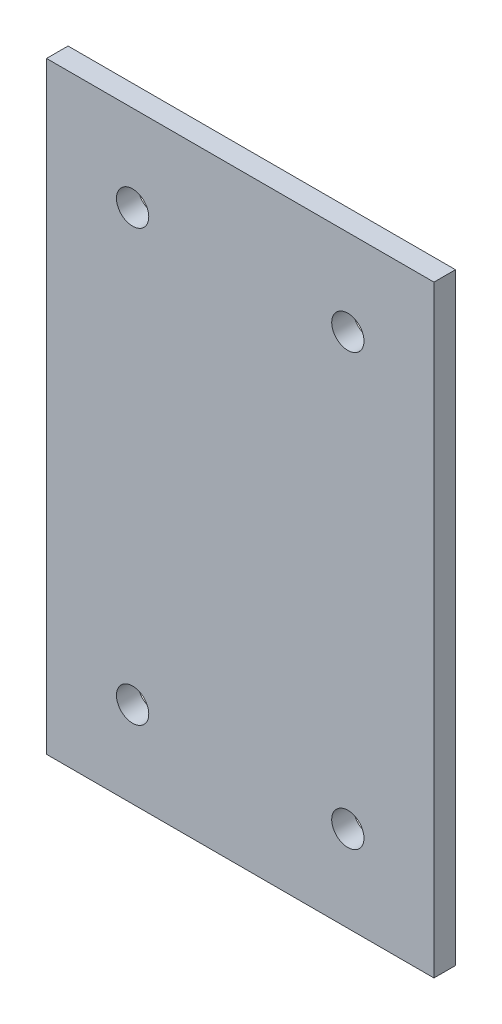
ISO-10303-21;
HEADER;
FILE_DESCRIPTION(('STEP AP214'),'2;1');
FILE_NAME('part.step','',(''),(''),'','','');
FILE_SCHEMA(('AUTOMOTIVE_DESIGN { 1 0 10303 214 1 1 1 1 }'));
ENDSEC;
DATA;
#1=APPLICATION_CONTEXT('core data for automotive mechanical design processes');
#2=APPLICATION_PROTOCOL_DEFINITION('international standard','automotive_design',2000,#1);
#3=PRODUCT_CONTEXT('',#1,'mechanical');
#4=PRODUCT('Part','Part','',(#3));
#5=PRODUCT_RELATED_PRODUCT_CATEGORY('part','',(#4));
#6=PRODUCT_DEFINITION_FORMATION('','',#4);
#7=PRODUCT_DEFINITION_CONTEXT('part definition',#1,'design');
#8=PRODUCT_DEFINITION('design','',#6,#7);
#9=PRODUCT_DEFINITION_SHAPE('','',#8);
#10=(LENGTH_UNIT() NAMED_UNIT(*) SI_UNIT(.MILLI.,.METRE.));
#11=(NAMED_UNIT(*) PLANE_ANGLE_UNIT() SI_UNIT($,.RADIAN.));
#12=(NAMED_UNIT(*) SI_UNIT($,.STERADIAN.) SOLID_ANGLE_UNIT());
#13=UNCERTAINTY_MEASURE_WITH_UNIT(LENGTH_MEASURE(1.E-05),#10,'distance_accuracy_value','');
#14=(GEOMETRIC_REPRESENTATION_CONTEXT(3) GLOBAL_UNCERTAINTY_ASSIGNED_CONTEXT((#13)) GLOBAL_UNIT_ASSIGNED_CONTEXT((#10,
#11,#12)) REPRESENTATION_CONTEXT('',''));
#15=CARTESIAN_POINT('',(0.,0.,0.));
#16=DIRECTION('',(0.,0.,1.));
#17=DIRECTION('',(1.,0.,0.));
#18=AXIS2_PLACEMENT_3D('',#15,#16,#17);
#19=CARTESIAN_POINT('',(0.,0.,2.));
#20=DIRECTION('',(0.,0.,-1.));
#21=DIRECTION('',(-1.,0.,0.));
#22=AXIS2_PLACEMENT_3D('',#19,#20,#21);
#23=PLANE('',#22);
#24=DIRECTION('',(0.,-1.,0.));
#25=VECTOR('',#24,1.);
#26=CARTESIAN_POINT('',(0.,0.,2.));
#27=LINE('',#26,#25);
#28=CARTESIAN_POINT('',(0.,56.,2.));
#29=VERTEX_POINT('',#28);
#30=CARTESIAN_POINT('',(0.,0.,2.));
#31=VERTEX_POINT('',#30);
#32=EDGE_CURVE('E92',#29,#31,#27,.T.);
#33=ORIENTED_EDGE('',*,*,#32,.T.);
#34=DIRECTION('',(1.,0.,0.));
#35=VECTOR('',#34,1.);
#36=CARTESIAN_POINT('',(0.,0.,2.));
#37=LINE('',#36,#35);
#38=CARTESIAN_POINT('',(36.,0.,2.));
#39=VERTEX_POINT('',#38);
#40=EDGE_CURVE('E87',#31,#39,#37,.T.);
#41=ORIENTED_EDGE('',*,*,#40,.T.);
#42=DIRECTION('',(0.,1.,0.));
#43=VECTOR('',#42,1.);
#44=CARTESIAN_POINT('',(36.,0.,2.));
#45=LINE('',#44,#43);
#46=CARTESIAN_POINT('',(36.,56.,2.));
#47=VERTEX_POINT('',#46);
#48=EDGE_CURVE('E90',#39,#47,#45,.T.);
#49=ORIENTED_EDGE('',*,*,#48,.T.);
#50=DIRECTION('',(-1.,0.,0.));
#51=VECTOR('',#50,1.);
#52=CARTESIAN_POINT('',(0.,56.,2.));
#53=LINE('',#52,#51);
#54=EDGE_CURVE('E57',#47,#29,#53,.T.);
#55=ORIENTED_EDGE('',*,*,#54,.T.);
#56=EDGE_LOOP('',(#33,#41,#49,#55));
#57=FACE_BOUND('',#56,.T.);
#58=CARTESIAN_POINT('',(8.,8.,2.));
#59=DIRECTION('',(0.,0.,1.));
#60=DIRECTION('',(1.,0.,0.));
#61=AXIS2_PLACEMENT_3D('',#58,#59,#60);
#62=CIRCLE('',#61,1.5);
#63=CARTESIAN_POINT('',(9.5,8.,2.));
#64=VERTEX_POINT('',#63);
#65=EDGE_CURVE('E112',#64,#64,#62,.T.);
#66=ORIENTED_EDGE('',*,*,#65,.F.);
#67=EDGE_LOOP('',(#66));
#68=FACE_BOUND('',#67,.T.);
#69=CARTESIAN_POINT('',(28.,8.,2.));
#70=DIRECTION('',(0.,0.,1.));
#71=DIRECTION('',(1.,0.,0.));
#72=AXIS2_PLACEMENT_3D('',#69,#70,#71);
#73=CIRCLE('',#72,1.5);
#74=CARTESIAN_POINT('',(29.5,8.,2.));
#75=VERTEX_POINT('',#74);
#76=EDGE_CURVE('E134',#75,#75,#73,.T.);
#77=ORIENTED_EDGE('',*,*,#76,.F.);
#78=EDGE_LOOP('',(#77));
#79=FACE_BOUND('',#78,.T.);
#80=CARTESIAN_POINT('',(28.,48.,2.));
#81=DIRECTION('',(0.,0.,1.));
#82=DIRECTION('',(1.,0.,0.));
#83=AXIS2_PLACEMENT_3D('',#80,#81,#82);
#84=CIRCLE('',#83,1.5);
#85=CARTESIAN_POINT('',(29.5,48.,2.));
#86=VERTEX_POINT('',#85);
#87=EDGE_CURVE('E142',#86,#86,#84,.T.);
#88=ORIENTED_EDGE('',*,*,#87,.F.);
#89=EDGE_LOOP('',(#88));
#90=FACE_BOUND('',#89,.T.);
#91=CARTESIAN_POINT('',(8.,48.,2.));
#92=DIRECTION('',(0.,0.,1.));
#93=DIRECTION('',(1.,0.,0.));
#94=AXIS2_PLACEMENT_3D('',#91,#92,#93);
#95=CIRCLE('',#94,1.5);
#96=CARTESIAN_POINT('',(9.5,48.,2.));
#97=VERTEX_POINT('',#96);
#98=EDGE_CURVE('E150',#97,#97,#95,.T.);
#99=ORIENTED_EDGE('',*,*,#98,.F.);
#100=EDGE_LOOP('',(#99));
#101=FACE_BOUND('',#100,.T.);
#102=ADVANCED_FACE('F39',(#57,#68,#79,#90,#101),#23,.F.);
#103=CARTESIAN_POINT('',(0.,0.,0.));
#104=DIRECTION('',(0.,0.,-1.));
#105=DIRECTION('',(-1.,0.,0.));
#106=AXIS2_PLACEMENT_3D('',#103,#104,#105);
#107=PLANE('',#106);
#108=CARTESIAN_POINT('',(28.,48.,0.));
#109=DIRECTION('',(0.,0.,1.));
#110=DIRECTION('',(1.,0.,0.));
#111=AXIS2_PLACEMENT_3D('',#108,#109,#110);
#112=CIRCLE('',#111,1.5);
#113=CARTESIAN_POINT('',(29.5,48.,0.));
#114=VERTEX_POINT('',#113);
#115=EDGE_CURVE('E146',#114,#114,#112,.T.);
#116=ORIENTED_EDGE('',*,*,#115,.T.);
#117=EDGE_LOOP('',(#116));
#118=FACE_BOUND('',#117,.T.);
#119=CARTESIAN_POINT('',(8.,8.,0.));
#120=DIRECTION('',(0.,0.,1.));
#121=DIRECTION('',(1.,0.,0.));
#122=AXIS2_PLACEMENT_3D('',#119,#120,#121);
#123=CIRCLE('',#122,1.5);
#124=CARTESIAN_POINT('',(9.5,8.,0.));
#125=VERTEX_POINT('',#124);
#126=EDGE_CURVE('E130',#125,#125,#123,.T.);
#127=ORIENTED_EDGE('',*,*,#126,.T.);
#128=EDGE_LOOP('',(#127));
#129=FACE_BOUND('',#128,.T.);
#130=DIRECTION('',(0.,-1.,0.));
#131=VECTOR('',#130,1.);
#132=CARTESIAN_POINT('',(0.,0.,0.));
#133=LINE('',#132,#131);
#134=CARTESIAN_POINT('',(0.,56.,0.));
#135=VERTEX_POINT('',#134);
#136=CARTESIAN_POINT('',(0.,0.,0.));
#137=VERTEX_POINT('',#136);
#138=EDGE_CURVE('E108',#135,#137,#133,.T.);
#139=ORIENTED_EDGE('',*,*,#138,.F.);
#140=DIRECTION('',(-1.,0.,0.));
#141=VECTOR('',#140,1.);
#142=CARTESIAN_POINT('',(0.,56.,0.));
#143=LINE('',#142,#141);
#144=CARTESIAN_POINT('',(36.,56.,0.));
#145=VERTEX_POINT('',#144);
#146=EDGE_CURVE('E80',#145,#135,#143,.T.);
#147=ORIENTED_EDGE('',*,*,#146,.F.);
#148=DIRECTION('',(0.,1.,0.));
#149=VECTOR('',#148,1.);
#150=CARTESIAN_POINT('',(36.,0.,0.));
#151=LINE('',#150,#149);
#152=CARTESIAN_POINT('',(36.,0.,0.));
#153=VERTEX_POINT('',#152);
#154=EDGE_CURVE('E74',#153,#145,#151,.T.);
#155=ORIENTED_EDGE('',*,*,#154,.F.);
#156=DIRECTION('',(1.,0.,0.));
#157=VECTOR('',#156,1.);
#158=CARTESIAN_POINT('',(0.,0.,0.));
#159=LINE('',#158,#157);
#160=EDGE_CURVE('E97',#137,#153,#159,.T.);
#161=ORIENTED_EDGE('',*,*,#160,.F.);
#162=EDGE_LOOP('',(#139,#147,#155,#161));
#163=FACE_BOUND('',#162,.T.);
#164=CARTESIAN_POINT('',(28.,8.,0.));
#165=DIRECTION('',(0.,0.,1.));
#166=DIRECTION('',(1.,0.,0.));
#167=AXIS2_PLACEMENT_3D('',#164,#165,#166);
#168=CIRCLE('',#167,1.5);
#169=CARTESIAN_POINT('',(29.5,8.,0.));
#170=VERTEX_POINT('',#169);
#171=EDGE_CURVE('E138',#170,#170,#168,.T.);
#172=ORIENTED_EDGE('',*,*,#171,.T.);
#173=EDGE_LOOP('',(#172));
#174=FACE_BOUND('',#173,.T.);
#175=CARTESIAN_POINT('',(8.,48.,0.));
#176=DIRECTION('',(0.,0.,1.));
#177=DIRECTION('',(1.,0.,0.));
#178=AXIS2_PLACEMENT_3D('',#175,#176,#177);
#179=CIRCLE('',#178,1.5);
#180=CARTESIAN_POINT('',(9.5,48.,0.));
#181=VERTEX_POINT('',#180);
#182=EDGE_CURVE('E154',#181,#181,#179,.T.);
#183=ORIENTED_EDGE('',*,*,#182,.T.);
#184=EDGE_LOOP('',(#183));
#185=FACE_BOUND('',#184,.T.);
#186=ADVANCED_FACE('F125',(#118,#129,#163,#174,#185),#107,.T.);
#187=CARTESIAN_POINT('',(0.,0.,2.));
#188=DIRECTION('',(1.,0.,0.));
#189=DIRECTION('',(0.,0.,-1.));
#190=AXIS2_PLACEMENT_3D('',#187,#188,#189);
#191=PLANE('',#190);
#192=ORIENTED_EDGE('',*,*,#138,.T.);
#193=DIRECTION('',(0.,0.,-1.));
#194=VECTOR('',#193,1.);
#195=CARTESIAN_POINT('',(0.,0.,2.));
#196=LINE('',#195,#194);
#197=EDGE_CURVE('E11',#31,#137,#196,.T.);
#198=ORIENTED_EDGE('',*,*,#197,.F.);
#199=ORIENTED_EDGE('',*,*,#32,.F.);
#200=DIRECTION('',(0.,0.,-1.));
#201=VECTOR('',#200,1.);
#202=CARTESIAN_POINT('',(0.,56.,2.));
#203=LINE('',#202,#201);
#204=EDGE_CURVE('E104',#29,#135,#203,.T.);
#205=ORIENTED_EDGE('',*,*,#204,.T.);
#206=EDGE_LOOP('',(#192,#198,#199,#205));
#207=FACE_BOUND('',#206,.T.);
#208=ADVANCED_FACE('F41',(#207),#191,.F.);
#209=CARTESIAN_POINT('',(0.,0.,2.));
#210=DIRECTION('',(0.,1.,0.));
#211=DIRECTION('',(0.,0.,1.));
#212=AXIS2_PLACEMENT_3D('',#209,#210,#211);
#213=PLANE('',#212);
#214=ORIENTED_EDGE('',*,*,#160,.T.);
#215=DIRECTION('',(0.,0.,-1.));
#216=VECTOR('',#215,1.);
#217=CARTESIAN_POINT('',(36.,0.,2.));
#218=LINE('',#217,#216);
#219=EDGE_CURVE('E49',#39,#153,#218,.T.);
#220=ORIENTED_EDGE('',*,*,#219,.F.);
#221=ORIENTED_EDGE('',*,*,#40,.F.);
#222=ORIENTED_EDGE('',*,*,#197,.T.);
#223=EDGE_LOOP('',(#214,#220,#221,#222));
#224=FACE_BOUND('',#223,.T.);
#225=ADVANCED_FACE('F96',(#224),#213,.F.);
#226=CARTESIAN_POINT('',(36.,0.,2.));
#227=DIRECTION('',(-1.,0.,0.));
#228=DIRECTION('',(0.,0.,1.));
#229=AXIS2_PLACEMENT_3D('',#226,#227,#228);
#230=PLANE('',#229);
#231=ORIENTED_EDGE('',*,*,#154,.T.);
#232=DIRECTION('',(0.,0.,-1.));
#233=VECTOR('',#232,1.);
#234=CARTESIAN_POINT('',(36.,56.,2.));
#235=LINE('',#234,#233);
#236=EDGE_CURVE('E99',#47,#145,#235,.T.);
#237=ORIENTED_EDGE('',*,*,#236,.F.);
#238=ORIENTED_EDGE('',*,*,#48,.F.);
#239=ORIENTED_EDGE('',*,*,#219,.T.);
#240=EDGE_LOOP('',(#231,#237,#238,#239));
#241=FACE_BOUND('',#240,.T.);
#242=ADVANCED_FACE('F100',(#241),#230,.F.);
#243=CARTESIAN_POINT('',(0.,56.,2.));
#244=DIRECTION('',(0.,-1.,0.));
#245=DIRECTION('',(0.,0.,-1.));
#246=AXIS2_PLACEMENT_3D('',#243,#244,#245);
#247=PLANE('',#246);
#248=ORIENTED_EDGE('',*,*,#146,.T.);
#249=ORIENTED_EDGE('',*,*,#204,.F.);
#250=ORIENTED_EDGE('',*,*,#54,.F.);
#251=ORIENTED_EDGE('',*,*,#236,.T.);
#252=EDGE_LOOP('',(#248,#249,#250,#251));
#253=FACE_BOUND('',#252,.T.);
#254=ADVANCED_FACE('F122',(#253),#247,.F.);
#255=CARTESIAN_POINT('',(8.,8.,2.));
#256=DIRECTION('',(0.,0.,-1.));
#257=DIRECTION('',(-1.,0.,0.));
#258=AXIS2_PLACEMENT_3D('',#255,#256,#257);
#259=CYLINDRICAL_SURFACE('',#258,1.5);
#260=ORIENTED_EDGE('',*,*,#65,.T.);
#261=EDGE_LOOP('',(#260));
#262=FACE_BOUND('',#261,.T.);
#263=ORIENTED_EDGE('',*,*,#126,.F.);
#264=EDGE_LOOP('',(#263));
#265=FACE_BOUND('',#264,.T.);
#266=ADVANCED_FACE('F173',(#262,#265),#259,.F.);
#267=CARTESIAN_POINT('',(28.,8.,2.));
#268=DIRECTION('',(0.,0.,-1.));
#269=DIRECTION('',(-1.,0.,0.));
#270=AXIS2_PLACEMENT_3D('',#267,#268,#269);
#271=CYLINDRICAL_SURFACE('',#270,1.5);
#272=ORIENTED_EDGE('',*,*,#76,.T.);
#273=EDGE_LOOP('',(#272));
#274=FACE_BOUND('',#273,.T.);
#275=ORIENTED_EDGE('',*,*,#171,.F.);
#276=EDGE_LOOP('',(#275));
#277=FACE_BOUND('',#276,.T.);
#278=ADVANCED_FACE('F219',(#274,#277),#271,.F.);
#279=CARTESIAN_POINT('',(28.,48.,2.));
#280=DIRECTION('',(0.,0.,-1.));
#281=DIRECTION('',(-1.,0.,0.));
#282=AXIS2_PLACEMENT_3D('',#279,#280,#281);
#283=CYLINDRICAL_SURFACE('',#282,1.5);
#284=ORIENTED_EDGE('',*,*,#87,.T.);
#285=EDGE_LOOP('',(#284));
#286=FACE_BOUND('',#285,.T.);
#287=ORIENTED_EDGE('',*,*,#115,.F.);
#288=EDGE_LOOP('',(#287));
#289=FACE_BOUND('',#288,.T.);
#290=ADVANCED_FACE('F227',(#286,#289),#283,.F.);
#291=CARTESIAN_POINT('',(8.,48.,2.));
#292=DIRECTION('',(0.,0.,-1.));
#293=DIRECTION('',(-1.,0.,0.));
#294=AXIS2_PLACEMENT_3D('',#291,#292,#293);
#295=CYLINDRICAL_SURFACE('',#294,1.5);
#296=ORIENTED_EDGE('',*,*,#98,.T.);
#297=EDGE_LOOP('',(#296));
#298=FACE_BOUND('',#297,.T.);
#299=ORIENTED_EDGE('',*,*,#182,.F.);
#300=EDGE_LOOP('',(#299));
#301=FACE_BOUND('',#300,.T.);
#302=ADVANCED_FACE('F162',(#298,#301),#295,.F.);
#303=CLOSED_SHELL('',(#102,#186,#208,#225,#242,#254,#266,#278,#290,#302));
#304=MANIFOLD_SOLID_BREP('B2',#303);
#305=ADVANCED_BREP_SHAPE_REPRESENTATION('',(#18,#304),#14);
#306=SHAPE_DEFINITION_REPRESENTATION(#9,#305);
ENDSEC;
END-ISO-10303-21;
